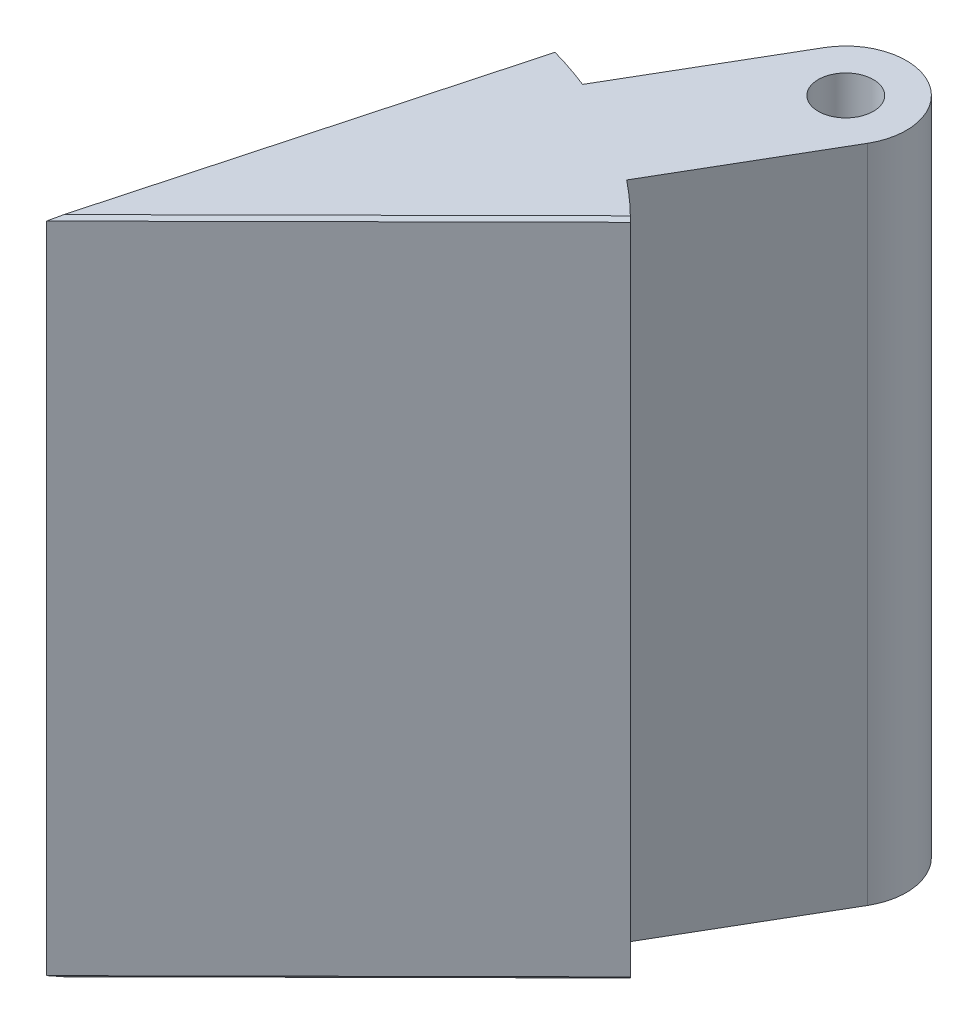
ISO-10303-21;
HEADER;
FILE_DESCRIPTION(('STEP AP214'),'2;1');
FILE_NAME('part.step','',(''),(''),'','','');
FILE_SCHEMA(('AUTOMOTIVE_DESIGN { 1 0 10303 214 1 1 1 1 }'));
ENDSEC;
DATA;
#1=APPLICATION_CONTEXT('core data for automotive mechanical design processes');
#2=APPLICATION_PROTOCOL_DEFINITION('international standard','automotive_design',2000,#1);
#3=PRODUCT_CONTEXT('',#1,'mechanical');
#4=PRODUCT('Part','Part','',(#3));
#5=PRODUCT_RELATED_PRODUCT_CATEGORY('part','',(#4));
#6=PRODUCT_DEFINITION_FORMATION('','',#4);
#7=PRODUCT_DEFINITION_CONTEXT('part definition',#1,'design');
#8=PRODUCT_DEFINITION('design','',#6,#7);
#9=PRODUCT_DEFINITION_SHAPE('','',#8);
#10=(LENGTH_UNIT() NAMED_UNIT(*) SI_UNIT(.MILLI.,.METRE.));
#11=(NAMED_UNIT(*) PLANE_ANGLE_UNIT() SI_UNIT($,.RADIAN.));
#12=(NAMED_UNIT(*) SI_UNIT($,.STERADIAN.) SOLID_ANGLE_UNIT());
#13=UNCERTAINTY_MEASURE_WITH_UNIT(LENGTH_MEASURE(1.E-05),#10,'distance_accuracy_value','');
#14=(GEOMETRIC_REPRESENTATION_CONTEXT(3) GLOBAL_UNCERTAINTY_ASSIGNED_CONTEXT((#13)) GLOBAL_UNIT_ASSIGNED_CONTEXT((#10,
#11,#12)) REPRESENTATION_CONTEXT('',''));
#15=CARTESIAN_POINT('',(0.,0.,0.));
#16=DIRECTION('',(0.,0.,1.));
#17=DIRECTION('',(1.,0.,0.));
#18=AXIS2_PLACEMENT_3D('',#15,#16,#17);
#19=CARTESIAN_POINT('',(0.791424121914342,20.,0.797403344482519));
#20=DIRECTION('',(-0.704440743246712,0.,-0.709762804924307));
#21=DIRECTION('',(-0.709762804924307,0.,0.704440743246712));
#22=AXIS2_PLACEMENT_3D('',#19,#20,#21);
#23=PLANE('',#22);
#24=DIRECTION('',(0.,-1.,0.));
#25=VECTOR('',#24,1.);
#26=CARTESIAN_POINT('',(-7.72076454665677,20.,9.24576398222127));
#27=LINE('',#26,#25);
#28=CARTESIAN_POINT('',(-7.72076454665677,19.9,9.24576398222127));
#29=VERTEX_POINT('',#28);
#30=CARTESIAN_POINT('',(-7.72076454665677,0.100000000000003,9.24576398222127));
#31=VERTEX_POINT('',#30);
#32=EDGE_CURVE('E140',#29,#31,#27,.T.);
#33=ORIENTED_EDGE('',*,*,#32,.T.);
#34=DIRECTION('',(0.709762804924307,0.,-0.704440743246712));
#35=VECTOR('',#34,1.);
#36=CARTESIAN_POINT('',(0.791424121914342,0.100000000000003,0.797403344482519));
#37=LINE('',#36,#35);
#38=CARTESIAN_POINT('',(1.15584161302369,0.100000000000003,0.435718389300135));
#39=VERTEX_POINT('',#38);
#40=EDGE_CURVE('E184',#31,#39,#37,.T.);
#41=ORIENTED_EDGE('',*,*,#40,.T.);
#42=DIRECTION('',(0.,-1.,0.));
#43=VECTOR('',#42,1.);
#44=CARTESIAN_POINT('',(1.15584161302369,20.,0.435718389300135));
#45=LINE('',#44,#43);
#46=CARTESIAN_POINT('',(1.15584161302369,19.9,0.435718389300135));
#47=VERTEX_POINT('',#46);
#48=EDGE_CURVE('E126',#47,#39,#45,.T.);
#49=ORIENTED_EDGE('',*,*,#48,.F.);
#50=DIRECTION('',(-0.709762804924307,0.,0.704440743246712));
#51=VECTOR('',#50,1.);
#52=CARTESIAN_POINT('',(-7.72076428665409,19.9,9.24576424418827));
#53=LINE('',#52,#51);
#54=EDGE_CURVE('E182',#47,#29,#53,.T.);
#55=ORIENTED_EDGE('',*,*,#54,.T.);
#56=EDGE_LOOP('',(#33,#41,#49,#55));
#57=FACE_BOUND('',#56,.T.);
#58=ADVANCED_FACE('F35',(#57),#23,.F.);
#59=CARTESIAN_POINT('',(-7.69918326267686,20.,9.25833333333598));
#60=DIRECTION('',(0.,-1.,0.));
#61=DIRECTION('',(0.,0.,-1.));
#62=AXIS2_PLACEMENT_3D('',#59,#60,#61);
#63=CYLINDRICAL_SURFACE('',#62,12.5);
#64=ORIENTED_EDGE('',*,*,#48,.T.);
#65=CARTESIAN_POINT('',(-7.69918326267686,0.124123624539368,9.25833333333598));
#66=DIRECTION('',(-0.498114826493843,0.707106781186546,-0.501878092395963));
#67=DIRECTION('',(-0.498114826493841,-0.707106781186549,-0.501878092395961));
#68=AXIS2_PLACEMENT_3D('',#65,#66,#67);
#69=ELLIPSE('',#68,17.6776695296637,12.5);
#70=CARTESIAN_POINT('',(1.08497664639827,0.,0.365159845103703));
#71=VERTEX_POINT('',#70);
#72=EDGE_CURVE('E188',#39,#71,#69,.T.);
#73=ORIENTED_EDGE('',*,*,#72,.T.);
#74=CARTESIAN_POINT('',(-7.69918326267686,0.,9.25833333333598));
#75=DIRECTION('',(0.,1.,0.));
#76=DIRECTION('',(0.,0.,1.));
#77=AXIS2_PLACEMENT_3D('',#74,#75,#76);
#78=CIRCLE('',#77,12.5);
#79=CARTESIAN_POINT('',(0.0893220998235454,0.,-0.518638806253179));
#80=VERTEX_POINT('',#79);
#81=EDGE_CURVE('E122',#71,#80,#78,.T.);
#82=ORIENTED_EDGE('',*,*,#81,.T.);
#83=DIRECTION('',(0.,-1.,0.));
#84=VECTOR('',#83,1.);
#85=CARTESIAN_POINT('',(0.0893220998235454,20.,-0.518638806253179));
#86=LINE('',#85,#84);
#87=CARTESIAN_POINT('',(0.0893220998235454,20.,-0.518638806253179));
#88=VERTEX_POINT('',#87);
#89=EDGE_CURVE('E118',#88,#80,#86,.T.);
#90=ORIENTED_EDGE('',*,*,#89,.F.);
#91=CARTESIAN_POINT('',(-7.69918326267686,20.,9.25833333333598));
#92=DIRECTION('',(0.,1.,0.));
#93=DIRECTION('',(0.,0.,1.));
#94=AXIS2_PLACEMENT_3D('',#91,#92,#93);
#95=CIRCLE('',#94,12.5);
#96=CARTESIAN_POINT('',(1.08497664639826,20.,0.365159845103703));
#97=VERTEX_POINT('',#96);
#98=EDGE_CURVE('E108',#97,#88,#95,.T.);
#99=ORIENTED_EDGE('',*,*,#98,.F.);
#100=CARTESIAN_POINT('',(-7.69918326267686,19.8758763754606,9.25833333333598));
#101=DIRECTION('',(0.498114826493841,0.707106781186549,0.501878092395961));
#102=DIRECTION('',(0.498114826493843,-0.707106781186546,0.501878092395963));
#103=AXIS2_PLACEMENT_3D('',#100,#101,#102);
#104=ELLIPSE('',#103,17.6776695296637,12.5);
#105=EDGE_CURVE('E186',#97,#47,#104,.F.);
#106=ORIENTED_EDGE('',*,*,#105,.T.);
#107=EDGE_LOOP('',(#64,#73,#82,#90,#99,#106));
#108=FACE_BOUND('',#107,.T.);
#109=ADVANCED_FACE('F120',(#108),#63,.T.);
#110=CARTESIAN_POINT('',(-0.158846874541581,20.,-0.0925090710070217));
#111=DIRECTION('',(0.864137638412013,0.,0.503255543317417));
#112=DIRECTION('',(0.503255543317417,0.,-0.864137638412013));
#113=AXIS2_PLACEMENT_3D('',#110,#111,#112);
#114=PLANE('',#113);
#115=DIRECTION('',(-0.503255543317417,0.,0.864137638412013));
#116=VECTOR('',#115,1.);
#117=CARTESIAN_POINT('',(-0.158846874541581,0.,-0.0925090710070217));
#118=LINE('',#117,#116);
#119=CARTESIAN_POINT('',(2.77676036230304,0.,-5.13322593669694));
#120=VERTEX_POINT('',#119);
#121=EDGE_CURVE('E146',#120,#80,#118,.T.);
#122=ORIENTED_EDGE('',*,*,#121,.F.);
#123=DIRECTION('',(0.,-1.,0.));
#124=VECTOR('',#123,1.);
#125=CARTESIAN_POINT('',(2.77676036230304,20.,-5.13322593669694));
#126=LINE('',#125,#124);
#127=CARTESIAN_POINT('',(2.77676036230304,20.,-5.13322593669694));
#128=VERTEX_POINT('',#127);
#129=EDGE_CURVE('E127',#128,#120,#126,.T.);
#130=ORIENTED_EDGE('',*,*,#129,.F.);
#131=DIRECTION('',(-0.503255543317417,0.,0.864137638412013));
#132=VECTOR('',#131,1.);
#133=CARTESIAN_POINT('',(-0.158846874541581,20.,-0.0925090710070217));
#134=LINE('',#133,#132);
#135=EDGE_CURVE('E112',#128,#88,#134,.T.);
#136=ORIENTED_EDGE('',*,*,#135,.T.);
#137=ORIENTED_EDGE('',*,*,#89,.T.);
#138=EDGE_LOOP('',(#122,#130,#136,#137));
#139=FACE_BOUND('',#138,.T.);
#140=ADVANCED_FACE('F129',(#139),#114,.T.);
#141=CARTESIAN_POINT('',(1.19106779581671,20.,-6.05669985868449));
#142=DIRECTION('',(0.,-1.,0.));
#143=DIRECTION('',(0.,0.,-1.));
#144=AXIS2_PLACEMENT_3D('',#141,#142,#143);
#145=CYLINDRICAL_SURFACE('',#144,1.8350000000003);
#146=CARTESIAN_POINT('',(1.19106779581671,0.,-6.05669985868449));
#147=DIRECTION('',(0.,1.,0.));
#148=DIRECTION('',(0.,0.,1.));
#149=AXIS2_PLACEMENT_3D('',#146,#147,#148);
#150=CIRCLE('',#149,1.8350000000003);
#151=CARTESIAN_POINT('',(-0.394624770669664,0.,-6.98017378067196));
#152=VERTEX_POINT('',#151);
#153=EDGE_CURVE('E148',#120,#152,#150,.T.);
#154=ORIENTED_EDGE('',*,*,#153,.T.);
#155=DIRECTION('',(0.,-1.,0.));
#156=VECTOR('',#155,1.);
#157=CARTESIAN_POINT('',(-0.394624770669664,20.,-6.98017378067196));
#158=LINE('',#157,#156);
#159=CARTESIAN_POINT('',(-0.394624770669664,20.,-6.98017378067196));
#160=VERTEX_POINT('',#159);
#161=EDGE_CURVE('E163',#160,#152,#158,.T.);
#162=ORIENTED_EDGE('',*,*,#161,.F.);
#163=CARTESIAN_POINT('',(1.19106779581671,20.,-6.05669985868449));
#164=DIRECTION('',(0.,1.,0.));
#165=DIRECTION('',(0.,0.,1.));
#166=AXIS2_PLACEMENT_3D('',#163,#164,#165);
#167=CIRCLE('',#166,1.8350000000003);
#168=EDGE_CURVE('E131',#128,#160,#167,.T.);
#169=ORIENTED_EDGE('',*,*,#168,.F.);
#170=ORIENTED_EDGE('',*,*,#129,.T.);
#171=EDGE_LOOP('',(#154,#162,#169,#170));
#172=FACE_BOUND('',#171,.T.);
#173=ADVANCED_FACE('F217',(#172),#145,.T.);
#174=CARTESIAN_POINT('',(-3.33023200751381,20.,-1.9394569149816));
#175=DIRECTION('',(0.864137638412061,0.,0.503255543317334));
#176=DIRECTION('',(0.503255543317334,0.,-0.864137638412061));
#177=AXIS2_PLACEMENT_3D('',#174,#175,#176);
#178=PLANE('',#177);
#179=DIRECTION('',(-0.503255543317334,0.,0.864137638412061));
#180=VECTOR('',#179,1.);
#181=CARTESIAN_POINT('',(-3.33023200751381,0.,-1.9394569149816));
#182=LINE('',#181,#180);
#183=CARTESIAN_POINT('',(-3.08579362895313,0.,-2.35918086237089));
#184=VERTEX_POINT('',#183);
#185=EDGE_CURVE('E150',#152,#184,#182,.T.);
#186=ORIENTED_EDGE('',*,*,#185,.T.);
#187=DIRECTION('',(0.,-1.,0.));
#188=VECTOR('',#187,1.);
#189=CARTESIAN_POINT('',(-3.08579362895313,20.,-2.35918086237089));
#190=LINE('',#189,#188);
#191=CARTESIAN_POINT('',(-3.08579362895313,20.,-2.35918086237089));
#192=VERTEX_POINT('',#191);
#193=EDGE_CURVE('E160',#192,#184,#190,.T.);
#194=ORIENTED_EDGE('',*,*,#193,.F.);
#195=DIRECTION('',(-0.503255543317334,0.,0.864137638412061));
#196=VECTOR('',#195,1.);
#197=CARTESIAN_POINT('',(-3.33023200751381,20.,-1.9394569149816));
#198=LINE('',#197,#196);
#199=EDGE_CURVE('E133',#160,#192,#198,.T.);
#200=ORIENTED_EDGE('',*,*,#199,.F.);
#201=ORIENTED_EDGE('',*,*,#161,.T.);
#202=EDGE_LOOP('',(#186,#194,#200,#201));
#203=FACE_BOUND('',#202,.T.);
#204=ADVANCED_FACE('F220',(#203),#178,.F.);
#205=CARTESIAN_POINT('',(-7.69918326267686,20.,9.25833333333598));
#206=DIRECTION('',(0.,-1.,0.));
#207=DIRECTION('',(0.,0.,-1.));
#208=AXIS2_PLACEMENT_3D('',#205,#206,#207);
#209=CYLINDRICAL_SURFACE('',#208,12.5);
#210=CARTESIAN_POINT('',(-7.69918326267686,0.,9.25833333333598));
#211=DIRECTION('',(0.,1.,0.));
#212=DIRECTION('',(0.,0.,1.));
#213=AXIS2_PLACEMENT_3D('',#210,#211,#212);
#214=CIRCLE('',#213,12.5);
#215=CARTESIAN_POINT('',(-4.34537405635662,0.,-2.78334278785254));
#216=VERTEX_POINT('',#215);
#217=EDGE_CURVE('E152',#184,#216,#214,.T.);
#218=ORIENTED_EDGE('',*,*,#217,.T.);
#219=CARTESIAN_POINT('',(-7.69918326267686,0.075876393870411,9.25833333333598));
#220=DIRECTION('',(-0.682319139943326,-0.707106781186545,-0.185581764370866));
#221=DIRECTION('',(0.682319139943321,-0.70710678118655,0.185581764370864));
#222=AXIS2_PLACEMENT_3D('',#219,#220,#221);
#223=ELLIPSE('',#222,17.6776695296638,12.5);
#224=CARTESIAN_POINT('',(-4.44181422342106,0.100000000000003,-2.80978776906011));
#225=VERTEX_POINT('',#224);
#226=EDGE_CURVE('E175',#216,#225,#223,.F.);
#227=ORIENTED_EDGE('',*,*,#226,.T.);
#228=DIRECTION('',(0.,-1.,0.));
#229=VECTOR('',#228,1.);
#230=CARTESIAN_POINT('',(-4.44181422342106,20.,-2.80978776906011));
#231=LINE('',#230,#229);
#232=CARTESIAN_POINT('',(-4.44181422342106,19.9,-2.80978776906011));
#233=VERTEX_POINT('',#232);
#234=EDGE_CURVE('E157',#233,#225,#231,.T.);
#235=ORIENTED_EDGE('',*,*,#234,.F.);
#236=CARTESIAN_POINT('',(-7.69918326267686,19.9241236061296,9.25833333333598));
#237=DIRECTION('',(0.682319139943323,-0.707106781186548,0.185581764370865));
#238=DIRECTION('',(-0.682319139943324,-0.707106781186547,-0.185581764370865));
#239=AXIS2_PLACEMENT_3D('',#236,#237,#238);
#240=ELLIPSE('',#239,17.6776695296637,12.5);
#241=CARTESIAN_POINT('',(-4.34537405635662,20.,-2.78334278785254));
#242=VERTEX_POINT('',#241);
#243=EDGE_CURVE('E173',#233,#242,#240,.T.);
#244=ORIENTED_EDGE('',*,*,#243,.T.);
#245=CARTESIAN_POINT('',(-7.69918326267686,20.,9.25833333333598));
#246=DIRECTION('',(0.,1.,0.));
#247=DIRECTION('',(0.,0.,1.));
#248=AXIS2_PLACEMENT_3D('',#245,#246,#247);
#249=CIRCLE('',#248,12.5);
#250=EDGE_CURVE('E138',#192,#242,#249,.T.);
#251=ORIENTED_EDGE('',*,*,#250,.F.);
#252=ORIENTED_EDGE('',*,*,#193,.T.);
#253=EDGE_LOOP('',(#218,#227,#235,#244,#251,#252));
#254=FACE_BOUND('',#253,.T.);
#255=ADVANCED_FACE('F224',(#254),#209,.T.);
#256=CARTESIAN_POINT('',(1.19106779581671,20.,-6.05669985868449));
#257=DIRECTION('',(0.,-1.,0.));
#258=DIRECTION('',(0.,0.,-1.));
#259=AXIS2_PLACEMENT_3D('',#256,#257,#258);
#260=CYLINDRICAL_SURFACE('',#259,0.835000000000257);
#261=CARTESIAN_POINT('',(1.19106779581671,20.,-6.05669985868449));
#262=DIRECTION('',(0.,1.,0.));
#263=DIRECTION('',(0.,0.,1.));
#264=AXIS2_PLACEMENT_3D('',#261,#262,#263);
#265=CIRCLE('',#264,0.835000000000257);
#266=CARTESIAN_POINT('',(1.19106779581671,20.,-5.22169985868423));
#267=VERTEX_POINT('',#266);
#268=EDGE_CURVE('E115',#267,#267,#265,.T.);
#269=ORIENTED_EDGE('',*,*,#268,.T.);
#270=EDGE_LOOP('',(#269));
#271=FACE_BOUND('',#270,.T.);
#272=CARTESIAN_POINT('',(1.19106779581671,0.,-6.05669985868449));
#273=DIRECTION('',(0.,1.,0.));
#274=DIRECTION('',(0.,0.,1.));
#275=AXIS2_PLACEMENT_3D('',#272,#273,#274);
#276=CIRCLE('',#275,0.835000000000257);
#277=CARTESIAN_POINT('',(1.19106779581671,0.,-5.22169985868423));
#278=VERTEX_POINT('',#277);
#279=EDGE_CURVE('E141',#278,#278,#276,.T.);
#280=ORIENTED_EDGE('',*,*,#279,.F.);
#281=EDGE_LOOP('',(#280));
#282=FACE_BOUND('',#281,.T.);
#283=ADVANCED_FACE('F245',(#271,#282),#260,.F.);
#284=CARTESIAN_POINT('',(-4.84744112219314,20.,-1.31843974978514));
#285=DIRECTION('',(-0.964944981574594,0.,-0.262452248102405));
#286=DIRECTION('',(-0.262452248102405,0.,0.964944981574594));
#287=AXIS2_PLACEMENT_3D('',#284,#285,#286);
#288=PLANE('',#287);
#289=ORIENTED_EDGE('',*,*,#234,.T.);
#290=DIRECTION('',(-0.262452248102405,0.,0.964944981574594));
#291=VECTOR('',#290,1.);
#292=CARTESIAN_POINT('',(-7.72076454665677,0.100000000000003,9.24576398222127));
#293=LINE('',#292,#291);
#294=EDGE_CURVE('E180',#225,#31,#293,.T.);
#295=ORIENTED_EDGE('',*,*,#294,.T.);
#296=ORIENTED_EDGE('',*,*,#32,.F.);
#297=DIRECTION('',(0.262452248102405,0.,-0.964944981574594));
#298=VECTOR('',#297,1.);
#299=CARTESIAN_POINT('',(-4.84744112219314,19.9,-1.31843974978514));
#300=LINE('',#299,#298);
#301=EDGE_CURVE('E177',#29,#233,#300,.T.);
#302=ORIENTED_EDGE('',*,*,#301,.T.);
#303=EDGE_LOOP('',(#289,#295,#296,#302));
#304=FACE_BOUND('',#303,.T.);
#305=ADVANCED_FACE('F227',(#304),#288,.T.);
#306=CARTESIAN_POINT('',(0.,20.,0.));
#307=DIRECTION('',(0.,1.,0.));
#308=DIRECTION('',(0.,0.,1.));
#309=AXIS2_PLACEMENT_3D('',#306,#307,#308);
#310=PLANE('',#309);
#311=ORIENTED_EDGE('',*,*,#268,.F.);
#312=EDGE_LOOP('',(#311));
#313=FACE_BOUND('',#312,.T.);
#314=ORIENTED_EDGE('',*,*,#250,.T.);
#315=DIRECTION('',(-0.262452248102405,0.,0.964944981574594));
#316=VECTOR('',#315,1.);
#317=CARTESIAN_POINT('',(-4.75094662403568,20.,-1.2921945249749));
#318=LINE('',#317,#316);
#319=CARTESIAN_POINT('',(-7.52632172978889,20.,8.91188754956184));
#320=VERTEX_POINT('',#319);
#321=EDGE_CURVE('E11',#242,#320,#318,.T.);
#322=ORIENTED_EDGE('',*,*,#321,.T.);
#323=DIRECTION('',(0.709762804924307,0.,-0.704440743246712));
#324=VECTOR('',#323,1.);
#325=CARTESIAN_POINT('',(1.08539753869902,20.,0.364742108807702));
#326=LINE('',#325,#324);
#327=EDGE_CURVE('E44',#320,#97,#326,.T.);
#328=ORIENTED_EDGE('',*,*,#327,.T.);
#329=ORIENTED_EDGE('',*,*,#98,.T.);
#330=ORIENTED_EDGE('',*,*,#135,.F.);
#331=ORIENTED_EDGE('',*,*,#168,.T.);
#332=ORIENTED_EDGE('',*,*,#199,.T.);
#333=EDGE_LOOP('',(#314,#322,#328,#329,#330,#331,#332));
#334=FACE_BOUND('',#333,.T.);
#335=ADVANCED_FACE('F110',(#313,#334),#310,.T.);
#336=CARTESIAN_POINT('',(0.,0.,0.));
#337=DIRECTION('',(0.,1.,0.));
#338=DIRECTION('',(0.,0.,1.));
#339=AXIS2_PLACEMENT_3D('',#336,#337,#338);
#340=PLANE('',#339);
#341=ORIENTED_EDGE('',*,*,#279,.T.);
#342=EDGE_LOOP('',(#341));
#343=FACE_BOUND('',#342,.T.);
#344=DIRECTION('',(-0.709762804924307,0.,0.704440743246712));
#345=VECTOR('',#344,1.);
#346=CARTESIAN_POINT('',(0.720980047589669,0.,0.726427063990087));
#347=LINE('',#346,#345);
#348=CARTESIAN_POINT('',(-7.52632172978889,0.,8.91188754956184));
#349=VERTEX_POINT('',#348);
#350=EDGE_CURVE('E168',#71,#349,#347,.T.);
#351=ORIENTED_EDGE('',*,*,#350,.T.);
#352=DIRECTION('',(0.262452248102405,0.,-0.964944981574594));
#353=VECTOR('',#352,1.);
#354=CARTESIAN_POINT('',(-4.3453197252636,0.,-2.78354254424987));
#355=LINE('',#354,#353);
#356=EDGE_CURVE('E170',#349,#216,#355,.T.);
#357=ORIENTED_EDGE('',*,*,#356,.T.);
#358=ORIENTED_EDGE('',*,*,#217,.F.);
#359=ORIENTED_EDGE('',*,*,#185,.F.);
#360=ORIENTED_EDGE('',*,*,#153,.F.);
#361=ORIENTED_EDGE('',*,*,#121,.T.);
#362=ORIENTED_EDGE('',*,*,#81,.F.);
#363=EDGE_LOOP('',(#351,#357,#358,#359,#360,#361,#362));
#364=FACE_BOUND('',#363,.T.);
#365=ADVANCED_FACE('F211',(#343,#364),#340,.F.);
#366=CARTESIAN_POINT('',(0.791424121914342,0.100000000000003,0.797403344482519));
#367=DIRECTION('',(-0.498114826493843,0.707106781186546,-0.501878092395963));
#368=DIRECTION('',(0.709762804924307,0.,-0.704440743246712));
#369=AXIS2_PLACEMENT_3D('',#366,#367,#368);
#370=PLANE('',#369);
#371=ORIENTED_EDGE('',*,*,#72,.F.);
#372=ORIENTED_EDGE('',*,*,#40,.F.);
#373=DIRECTION('',(-0.487201865554752,0.250562807085727,0.83657194664015));
#374=VECTOR('',#373,1.);
#375=CARTESIAN_POINT('',(-2.25688527128769,-2.71001587668091,-0.136236087578721));
#376=LINE('',#375,#374);
#377=EDGE_CURVE('E144',#349,#31,#376,.T.);
#378=ORIENTED_EDGE('',*,*,#377,.F.);
#379=ORIENTED_EDGE('',*,*,#350,.F.);
#380=EDGE_LOOP('',(#371,#372,#378,#379));
#381=FACE_BOUND('',#380,.T.);
#382=ADVANCED_FACE('F208',(#381),#370,.F.);
#383=CARTESIAN_POINT('',(-4.75094662403568,0.,-1.2921945249749));
#384=DIRECTION('',(-0.682319139943326,-0.707106781186545,-0.185581764370866));
#385=DIRECTION('',(-0.262452248102405,0.,0.964944981574594));
#386=AXIS2_PLACEMENT_3D('',#383,#384,#385);
#387=PLANE('',#386);
#388=ORIENTED_EDGE('',*,*,#377,.T.);
#389=ORIENTED_EDGE('',*,*,#294,.F.);
#390=ORIENTED_EDGE('',*,*,#226,.F.);
#391=ORIENTED_EDGE('',*,*,#356,.F.);
#392=EDGE_LOOP('',(#388,#389,#390,#391));
#393=FACE_BOUND('',#392,.T.);
#394=ADVANCED_FACE('F228',(#393),#387,.T.);
#395=CARTESIAN_POINT('',(0.720980047589668,20.,0.726427063990086));
#396=DIRECTION('',(0.498114826493841,0.707106781186549,0.501878092395961));
#397=DIRECTION('',(-0.709762804924307,0.,0.704440743246712));
#398=AXIS2_PLACEMENT_3D('',#395,#396,#397);
#399=PLANE('',#398);
#400=ORIENTED_EDGE('',*,*,#105,.F.);
#401=ORIENTED_EDGE('',*,*,#327,.F.);
#402=DIRECTION('',(0.487201865554752,0.250562807085725,-0.83657194664015));
#403=VECTOR('',#402,1.);
#404=CARTESIAN_POINT('',(-2.23247033787752,22.7225722207398,-0.178158850634597));
#405=LINE('',#404,#403);
#406=EDGE_CURVE('E39',#29,#320,#405,.T.);
#407=ORIENTED_EDGE('',*,*,#406,.F.);
#408=ORIENTED_EDGE('',*,*,#54,.F.);
#409=EDGE_LOOP('',(#400,#401,#407,#408));
#410=FACE_BOUND('',#409,.T.);
#411=ADVANCED_FACE('F37',(#410),#399,.T.);
#412=CARTESIAN_POINT('',(-4.84744112219314,19.9,-1.31843974978514));
#413=DIRECTION('',(0.682319139943323,-0.707106781186548,0.185581764370865));
#414=DIRECTION('',(0.262452248102405,0.,-0.964944981574594));
#415=AXIS2_PLACEMENT_3D('',#412,#413,#414);
#416=PLANE('',#415);
#417=ORIENTED_EDGE('',*,*,#406,.T.);
#418=ORIENTED_EDGE('',*,*,#321,.F.);
#419=ORIENTED_EDGE('',*,*,#243,.F.);
#420=ORIENTED_EDGE('',*,*,#301,.F.);
#421=EDGE_LOOP('',(#417,#418,#419,#420));
#422=FACE_BOUND('',#421,.T.);
#423=ADVANCED_FACE('F199',(#422),#416,.F.);
#424=CLOSED_SHELL('',(#58,#109,#140,#173,#204,#255,#283,#305,#335,#365,#382,#394,#411,#423));
#425=MANIFOLD_SOLID_BREP('B2',#424);
#426=ADVANCED_BREP_SHAPE_REPRESENTATION('',(#18,#425),#14);
#427=SHAPE_DEFINITION_REPRESENTATION(#9,#426);
ENDSEC;
END-ISO-10303-21;
